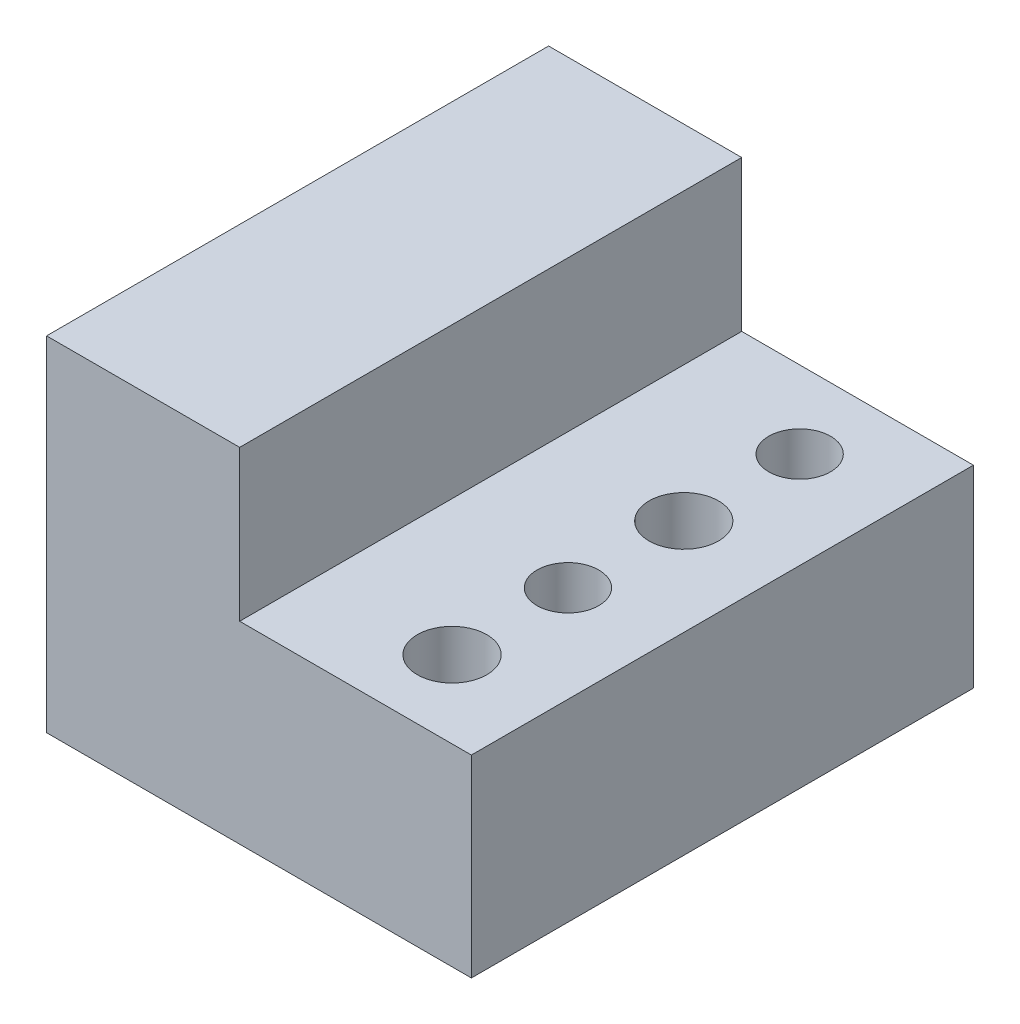
ISO-10303-21;
HEADER;
FILE_DESCRIPTION(('STEP AP214'),'2;1');
FILE_NAME('part.step','',(''),(''),'','','');
FILE_SCHEMA(('AUTOMOTIVE_DESIGN { 1 0 10303 214 1 1 1 1 }'));
ENDSEC;
DATA;
#1=APPLICATION_CONTEXT('core data for automotive mechanical design processes');
#2=APPLICATION_PROTOCOL_DEFINITION('international standard','automotive_design',2000,#1);
#3=PRODUCT_CONTEXT('',#1,'mechanical');
#4=PRODUCT('Part','Part','',(#3));
#5=PRODUCT_RELATED_PRODUCT_CATEGORY('part','',(#4));
#6=PRODUCT_DEFINITION_FORMATION('','',#4);
#7=PRODUCT_DEFINITION_CONTEXT('part definition',#1,'design');
#8=PRODUCT_DEFINITION('design','',#6,#7);
#9=PRODUCT_DEFINITION_SHAPE('','',#8);
#10=(LENGTH_UNIT() NAMED_UNIT(*) SI_UNIT(.MILLI.,.METRE.));
#11=(NAMED_UNIT(*) PLANE_ANGLE_UNIT() SI_UNIT($,.RADIAN.));
#12=(NAMED_UNIT(*) SI_UNIT($,.STERADIAN.) SOLID_ANGLE_UNIT());
#13=UNCERTAINTY_MEASURE_WITH_UNIT(LENGTH_MEASURE(1.E-05),#10,'distance_accuracy_value','');
#14=(GEOMETRIC_REPRESENTATION_CONTEXT(3) GLOBAL_UNCERTAINTY_ASSIGNED_CONTEXT((#13)) GLOBAL_UNIT_ASSIGNED_CONTEXT((#10,
#11,#12)) REPRESENTATION_CONTEXT('',''));
#15=CARTESIAN_POINT('',(0.,0.,0.));
#16=DIRECTION('',(0.,0.,1.));
#17=DIRECTION('',(1.,0.,0.));
#18=AXIS2_PLACEMENT_3D('',#15,#16,#17);
#19=CARTESIAN_POINT('',(-12.5,0.,55.));
#20=DIRECTION('',(0.,1.,0.));
#21=DIRECTION('',(0.,0.,1.));
#22=AXIS2_PLACEMENT_3D('',#19,#20,#21);
#23=CYLINDRICAL_SURFACE('',#22,4.50000000000001);
#24=CARTESIAN_POINT('',(-12.5,25.,55.));
#25=DIRECTION('',(0.,1.,0.));
#26=DIRECTION('',(0.,0.,1.));
#27=AXIS2_PLACEMENT_3D('',#24,#25,#26);
#28=CIRCLE('',#27,4.50000000000001);
#29=CARTESIAN_POINT('',(-12.5,25.,59.5));
#30=VERTEX_POINT('',#29);
#31=EDGE_CURVE('E144',#30,#30,#28,.T.);
#32=ORIENTED_EDGE('',*,*,#31,.T.);
#33=EDGE_LOOP('',(#32));
#34=FACE_BOUND('',#33,.T.);
#35=CARTESIAN_POINT('',(-12.5,10.,55.));
#36=DIRECTION('',(0.,-1.,0.));
#37=DIRECTION('',(1.,0.,0.));
#38=AXIS2_PLACEMENT_3D('',#35,#36,#37);
#39=CIRCLE('',#38,4.50000000000001);
#40=CARTESIAN_POINT('',(-7.99999999999999,10.,55.));
#41=VERTEX_POINT('',#40);
#42=EDGE_CURVE('E38',#41,#41,#39,.F.);
#43=ORIENTED_EDGE('',*,*,#42,.F.);
#44=EDGE_LOOP('',(#43));
#45=FACE_BOUND('',#44,.T.);
#46=ADVANCED_FACE('F34',(#34,#45),#23,.F.);
#47=CARTESIAN_POINT('',(-12.5,0.,25.));
#48=DIRECTION('',(0.,1.,0.));
#49=DIRECTION('',(0.,0.,1.));
#50=AXIS2_PLACEMENT_3D('',#47,#48,#49);
#51=CYLINDRICAL_SURFACE('',#50,4.5);
#52=CARTESIAN_POINT('',(-12.5,25.,25.));
#53=DIRECTION('',(0.,1.,0.));
#54=DIRECTION('',(0.,0.,1.));
#55=AXIS2_PLACEMENT_3D('',#52,#53,#54);
#56=CIRCLE('',#55,4.5);
#57=CARTESIAN_POINT('',(-12.5,25.,29.5));
#58=VERTEX_POINT('',#57);
#59=EDGE_CURVE('E163',#58,#58,#56,.T.);
#60=ORIENTED_EDGE('',*,*,#59,.T.);
#61=EDGE_LOOP('',(#60));
#62=FACE_BOUND('',#61,.T.);
#63=CARTESIAN_POINT('',(-12.5,10.,25.));
#64=DIRECTION('',(0.,-1.,0.));
#65=DIRECTION('',(1.,0.,0.));
#66=AXIS2_PLACEMENT_3D('',#63,#64,#65);
#67=CIRCLE('',#66,4.5);
#68=CARTESIAN_POINT('',(-8.,10.,25.));
#69=VERTEX_POINT('',#68);
#70=EDGE_CURVE('E138',#69,#69,#67,.F.);
#71=ORIENTED_EDGE('',*,*,#70,.F.);
#72=EDGE_LOOP('',(#71));
#73=FACE_BOUND('',#72,.T.);
#74=ADVANCED_FACE('F202',(#62,#73),#51,.F.);
#75=CARTESIAN_POINT('',(-30.,25.,65.));
#76=DIRECTION('',(0.,-1.,0.));
#77=DIRECTION('',(0.,0.,-1.));
#78=AXIS2_PLACEMENT_3D('',#75,#76,#77);
#79=PLANE('',#78);
#80=ORIENTED_EDGE('',*,*,#59,.F.);
#81=EDGE_LOOP('',(#80));
#82=FACE_BOUND('',#81,.T.);
#83=ORIENTED_EDGE('',*,*,#31,.F.);
#84=EDGE_LOOP('',(#83));
#85=FACE_BOUND('',#84,.T.);
#86=CARTESIAN_POINT('',(-12.5,25.,10.));
#87=DIRECTION('',(0.,1.,0.));
#88=DIRECTION('',(0.,0.,1.));
#89=AXIS2_PLACEMENT_3D('',#86,#87,#88);
#90=CIRCLE('',#89,4.);
#91=CARTESIAN_POINT('',(-12.5,25.,14.));
#92=VERTEX_POINT('',#91);
#93=EDGE_CURVE('E166',#92,#92,#90,.T.);
#94=ORIENTED_EDGE('',*,*,#93,.F.);
#95=EDGE_LOOP('',(#94));
#96=FACE_BOUND('',#95,.T.);
#97=DIRECTION('',(-1.,0.,0.));
#98=VECTOR('',#97,1.);
#99=CARTESIAN_POINT('',(-30.,25.,0.));
#100=LINE('',#99,#98);
#101=CARTESIAN_POINT('',(0.,25.,0.));
#102=VERTEX_POINT('',#101);
#103=CARTESIAN_POINT('',(-30.,25.,0.));
#104=VERTEX_POINT('',#103);
#105=EDGE_CURVE('E76',#102,#104,#100,.T.);
#106=ORIENTED_EDGE('',*,*,#105,.T.);
#107=DIRECTION('',(0.,0.,-1.));
#108=VECTOR('',#107,1.);
#109=CARTESIAN_POINT('',(-30.,25.,65.));
#110=LINE('',#109,#108);
#111=CARTESIAN_POINT('',(-30.,25.,65.));
#112=VERTEX_POINT('',#111);
#113=EDGE_CURVE('E113',#112,#104,#110,.T.);
#114=ORIENTED_EDGE('',*,*,#113,.F.);
#115=DIRECTION('',(-1.,0.,0.));
#116=VECTOR('',#115,1.);
#117=CARTESIAN_POINT('',(-30.,25.,65.));
#118=LINE('',#117,#116);
#119=CARTESIAN_POINT('',(0.,25.,65.));
#120=VERTEX_POINT('',#119);
#121=EDGE_CURVE('E101',#120,#112,#118,.T.);
#122=ORIENTED_EDGE('',*,*,#121,.F.);
#123=DIRECTION('',(0.,0.,-1.));
#124=VECTOR('',#123,1.);
#125=CARTESIAN_POINT('',(0.,25.,65.));
#126=LINE('',#125,#124);
#127=EDGE_CURVE('E108',#120,#102,#126,.T.);
#128=ORIENTED_EDGE('',*,*,#127,.T.);
#129=EDGE_LOOP('',(#106,#114,#122,#128));
#130=FACE_BOUND('',#129,.T.);
#131=CARTESIAN_POINT('',(-12.5,25.,40.));
#132=DIRECTION('',(0.,1.,0.));
#133=DIRECTION('',(0.,0.,1.));
#134=AXIS2_PLACEMENT_3D('',#131,#132,#133);
#135=CIRCLE('',#134,4.);
#136=CARTESIAN_POINT('',(-12.5,25.,44.));
#137=VERTEX_POINT('',#136);
#138=EDGE_CURVE('E174',#137,#137,#135,.T.);
#139=ORIENTED_EDGE('',*,*,#138,.F.);
#140=EDGE_LOOP('',(#139));
#141=FACE_BOUND('',#140,.T.);
#142=ADVANCED_FACE('F115',(#82,#85,#96,#130,#141),#79,.F.);
#143=CARTESIAN_POINT('',(-55.,44.5,65.));
#144=DIRECTION('',(0.,-1.,0.));
#145=DIRECTION('',(0.,0.,-1.));
#146=AXIS2_PLACEMENT_3D('',#143,#144,#145);
#147=PLANE('',#146);
#148=DIRECTION('',(-1.,0.,0.));
#149=VECTOR('',#148,1.);
#150=CARTESIAN_POINT('',(-55.,44.5,0.));
#151=LINE('',#150,#149);
#152=CARTESIAN_POINT('',(-30.,44.5,0.));
#153=VERTEX_POINT('',#152);
#154=CARTESIAN_POINT('',(-55.,44.5,0.));
#155=VERTEX_POINT('',#154);
#156=EDGE_CURVE('E122',#153,#155,#151,.T.);
#157=ORIENTED_EDGE('',*,*,#156,.T.);
#158=DIRECTION('',(0.,0.,-1.));
#159=VECTOR('',#158,1.);
#160=CARTESIAN_POINT('',(-55.,44.5,65.));
#161=LINE('',#160,#159);
#162=CARTESIAN_POINT('',(-55.,44.5,65.));
#163=VERTEX_POINT('',#162);
#164=EDGE_CURVE('E11',#163,#155,#161,.T.);
#165=ORIENTED_EDGE('',*,*,#164,.F.);
#166=DIRECTION('',(-1.,0.,0.));
#167=VECTOR('',#166,1.);
#168=CARTESIAN_POINT('',(-55.,44.5,65.));
#169=LINE('',#168,#167);
#170=CARTESIAN_POINT('',(-30.,44.5,65.));
#171=VERTEX_POINT('',#170);
#172=EDGE_CURVE('E133',#171,#163,#169,.T.);
#173=ORIENTED_EDGE('',*,*,#172,.F.);
#174=DIRECTION('',(0.,0.,-1.));
#175=VECTOR('',#174,1.);
#176=CARTESIAN_POINT('',(-30.,44.5,65.));
#177=LINE('',#176,#175);
#178=EDGE_CURVE('E118',#171,#153,#177,.T.);
#179=ORIENTED_EDGE('',*,*,#178,.T.);
#180=EDGE_LOOP('',(#157,#165,#173,#179));
#181=FACE_BOUND('',#180,.T.);
#182=ADVANCED_FACE('F36',(#181),#147,.F.);
#183=CARTESIAN_POINT('',(-55.,0.,65.));
#184=DIRECTION('',(1.,0.,0.));
#185=DIRECTION('',(0.,0.,-1.));
#186=AXIS2_PLACEMENT_3D('',#183,#184,#185);
#187=PLANE('',#186);
#188=CARTESIAN_POINT('',(-55.,32.,10.));
#189=DIRECTION('',(-1.,0.,0.));
#190=DIRECTION('',(0.,0.,1.));
#191=AXIS2_PLACEMENT_3D('',#188,#189,#190);
#192=CIRCLE('',#191,3.4);
#193=CARTESIAN_POINT('',(-55.,32.,13.4));
#194=VERTEX_POINT('',#193);
#195=EDGE_CURVE('E418',#194,#194,#192,.T.);
#196=ORIENTED_EDGE('',*,*,#195,.F.);
#197=EDGE_LOOP('',(#196));
#198=FACE_BOUND('',#197,.T.);
#199=CARTESIAN_POINT('',(-55.,32.,25.));
#200=DIRECTION('',(-1.,0.,0.));
#201=DIRECTION('',(0.,0.,1.));
#202=AXIS2_PLACEMENT_3D('',#199,#200,#201);
#203=CIRCLE('',#202,3.99999999999999);
#204=CARTESIAN_POINT('',(-55.,32.,29.));
#205=VERTEX_POINT('',#204);
#206=EDGE_CURVE('E422',#205,#205,#203,.T.);
#207=ORIENTED_EDGE('',*,*,#206,.F.);
#208=EDGE_LOOP('',(#207));
#209=FACE_BOUND('',#208,.T.);
#210=CARTESIAN_POINT('',(-55.,32.,40.));
#211=DIRECTION('',(-1.,0.,0.));
#212=DIRECTION('',(0.,0.,1.));
#213=AXIS2_PLACEMENT_3D('',#210,#211,#212);
#214=CIRCLE('',#213,3.4);
#215=CARTESIAN_POINT('',(-55.,32.,43.4));
#216=VERTEX_POINT('',#215);
#217=EDGE_CURVE('E426',#216,#216,#214,.T.);
#218=ORIENTED_EDGE('',*,*,#217,.F.);
#219=EDGE_LOOP('',(#218));
#220=FACE_BOUND('',#219,.T.);
#221=CARTESIAN_POINT('',(-55.,32.,55.));
#222=DIRECTION('',(-1.,0.,0.));
#223=DIRECTION('',(0.,0.,1.));
#224=AXIS2_PLACEMENT_3D('',#221,#222,#223);
#225=CIRCLE('',#224,4.);
#226=CARTESIAN_POINT('',(-55.,32.,59.));
#227=VERTEX_POINT('',#226);
#228=EDGE_CURVE('E154',#227,#227,#225,.T.);
#229=ORIENTED_EDGE('',*,*,#228,.F.);
#230=EDGE_LOOP('',(#229));
#231=FACE_BOUND('',#230,.T.);
#232=DIRECTION('',(0.,-1.,0.));
#233=VECTOR('',#232,1.);
#234=CARTESIAN_POINT('',(-55.,0.,0.));
#235=LINE('',#234,#233);
#236=CARTESIAN_POINT('',(-55.,0.,0.));
#237=VERTEX_POINT('',#236);
#238=EDGE_CURVE('E125',#155,#237,#235,.T.);
#239=ORIENTED_EDGE('',*,*,#238,.T.);
#240=DIRECTION('',(0.,0.,-1.));
#241=VECTOR('',#240,1.);
#242=CARTESIAN_POINT('',(-55.,0.,65.));
#243=LINE('',#242,#241);
#244=CARTESIAN_POINT('',(-55.,0.,65.));
#245=VERTEX_POINT('',#244);
#246=EDGE_CURVE('E44',#245,#237,#243,.T.);
#247=ORIENTED_EDGE('',*,*,#246,.F.);
#248=DIRECTION('',(0.,-1.,0.));
#249=VECTOR('',#248,1.);
#250=CARTESIAN_POINT('',(-55.,0.,65.));
#251=LINE('',#250,#249);
#252=EDGE_CURVE('E90',#163,#245,#251,.T.);
#253=ORIENTED_EDGE('',*,*,#252,.F.);
#254=ORIENTED_EDGE('',*,*,#164,.T.);
#255=EDGE_LOOP('',(#239,#247,#253,#254));
#256=FACE_BOUND('',#255,.T.);
#257=ADVANCED_FACE('F182',(#198,#209,#220,#231,#256),#187,.F.);
#258=CARTESIAN_POINT('',(0.,0.,65.));
#259=DIRECTION('',(0.,1.,0.));
#260=DIRECTION('',(-1.,0.,0.));
#261=AXIS2_PLACEMENT_3D('',#258,#259,#260);
#262=PLANE('',#261);
#263=CARTESIAN_POINT('',(-12.5,0.,55.));
#264=DIRECTION('',(0.,-1.,0.));
#265=DIRECTION('',(1.,0.,0.));
#266=AXIS2_PLACEMENT_3D('',#263,#264,#265);
#267=CIRCLE('',#266,7.5);
#268=CARTESIAN_POINT('',(-5.,0.,55.));
#269=VERTEX_POINT('',#268);
#270=EDGE_CURVE('E146',#269,#269,#267,.T.);
#271=ORIENTED_EDGE('',*,*,#270,.F.);
#272=EDGE_LOOP('',(#271));
#273=FACE_BOUND('',#272,.T.);
#274=CARTESIAN_POINT('',(-12.5,0.,25.));
#275=DIRECTION('',(0.,-1.,0.));
#276=DIRECTION('',(1.,0.,0.));
#277=AXIS2_PLACEMENT_3D('',#274,#275,#276);
#278=CIRCLE('',#277,7.5);
#279=CARTESIAN_POINT('',(-5.,0.,25.));
#280=VERTEX_POINT('',#279);
#281=EDGE_CURVE('E159',#280,#280,#278,.T.);
#282=ORIENTED_EDGE('',*,*,#281,.F.);
#283=EDGE_LOOP('',(#282));
#284=FACE_BOUND('',#283,.T.);
#285=CARTESIAN_POINT('',(-12.5,0.,10.));
#286=DIRECTION('',(0.,1.,0.));
#287=DIRECTION('',(-1.,0.,0.));
#288=AXIS2_PLACEMENT_3D('',#285,#286,#287);
#289=CIRCLE('',#288,3.99999999999999);
#290=CARTESIAN_POINT('',(-16.5,0.,10.));
#291=VERTEX_POINT('',#290);
#292=EDGE_CURVE('E171',#291,#291,#289,.T.);
#293=ORIENTED_EDGE('',*,*,#292,.T.);
#294=EDGE_LOOP('',(#293));
#295=FACE_BOUND('',#294,.T.);
#296=CARTESIAN_POINT('',(-12.5,0.,40.));
#297=DIRECTION('',(0.,1.,0.));
#298=DIRECTION('',(-1.,0.,0.));
#299=AXIS2_PLACEMENT_3D('',#296,#297,#298);
#300=CIRCLE('',#299,3.99999999999999);
#301=CARTESIAN_POINT('',(-16.5,0.,40.));
#302=VERTEX_POINT('',#301);
#303=EDGE_CURVE('E126',#302,#302,#300,.T.);
#304=ORIENTED_EDGE('',*,*,#303,.T.);
#305=EDGE_LOOP('',(#304));
#306=FACE_BOUND('',#305,.T.);
#307=DIRECTION('',(1.,0.,0.));
#308=VECTOR('',#307,1.);
#309=CARTESIAN_POINT('',(0.,0.,0.));
#310=LINE('',#309,#308);
#311=CARTESIAN_POINT('',(0.,0.,0.));
#312=VERTEX_POINT('',#311);
#313=EDGE_CURVE('E128',#237,#312,#310,.T.);
#314=ORIENTED_EDGE('',*,*,#313,.T.);
#315=DIRECTION('',(0.,0.,-1.));
#316=VECTOR('',#315,1.);
#317=CARTESIAN_POINT('',(0.,0.,65.));
#318=LINE('',#317,#316);
#319=CARTESIAN_POINT('',(0.,0.,65.));
#320=VERTEX_POINT('',#319);
#321=EDGE_CURVE('E112',#320,#312,#318,.T.);
#322=ORIENTED_EDGE('',*,*,#321,.F.);
#323=DIRECTION('',(1.,0.,0.));
#324=VECTOR('',#323,1.);
#325=CARTESIAN_POINT('',(0.,0.,65.));
#326=LINE('',#325,#324);
#327=EDGE_CURVE('E103',#245,#320,#326,.T.);
#328=ORIENTED_EDGE('',*,*,#327,.F.);
#329=ORIENTED_EDGE('',*,*,#246,.T.);
#330=EDGE_LOOP('',(#314,#322,#328,#329));
#331=FACE_BOUND('',#330,.T.);
#332=ADVANCED_FACE('F185',(#273,#284,#295,#306,#331),#262,.F.);
#333=CARTESIAN_POINT('',(0.,25.,65.));
#334=DIRECTION('',(-1.,0.,0.));
#335=DIRECTION('',(0.,-1.,0.));
#336=AXIS2_PLACEMENT_3D('',#333,#334,#335);
#337=PLANE('',#336);
#338=DIRECTION('',(0.,1.,0.));
#339=VECTOR('',#338,1.);
#340=CARTESIAN_POINT('',(0.,25.,0.));
#341=LINE('',#340,#339);
#342=EDGE_CURVE('E111',#312,#102,#341,.T.);
#343=ORIENTED_EDGE('',*,*,#342,.T.);
#344=ORIENTED_EDGE('',*,*,#127,.F.);
#345=DIRECTION('',(0.,1.,0.));
#346=VECTOR('',#345,1.);
#347=CARTESIAN_POINT('',(0.,25.,65.));
#348=LINE('',#347,#346);
#349=EDGE_CURVE('E97',#320,#120,#348,.T.);
#350=ORIENTED_EDGE('',*,*,#349,.F.);
#351=ORIENTED_EDGE('',*,*,#321,.T.);
#352=EDGE_LOOP('',(#343,#344,#350,#351));
#353=FACE_BOUND('',#352,.T.);
#354=ADVANCED_FACE('F109',(#353),#337,.F.);
#355=CARTESIAN_POINT('',(-30.,44.5,65.));
#356=DIRECTION('',(-1.,0.,0.));
#357=DIRECTION('',(0.,-1.,0.));
#358=AXIS2_PLACEMENT_3D('',#355,#356,#357);
#359=PLANE('',#358);
#360=DIRECTION('',(0.,1.,0.));
#361=VECTOR('',#360,1.);
#362=CARTESIAN_POINT('',(-30.,44.5,0.));
#363=LINE('',#362,#361);
#364=EDGE_CURVE('E82',#104,#153,#363,.T.);
#365=ORIENTED_EDGE('',*,*,#364,.T.);
#366=ORIENTED_EDGE('',*,*,#178,.F.);
#367=DIRECTION('',(0.,1.,0.));
#368=VECTOR('',#367,1.);
#369=CARTESIAN_POINT('',(-30.,44.5,65.));
#370=LINE('',#369,#368);
#371=EDGE_CURVE('E53',#112,#171,#370,.T.);
#372=ORIENTED_EDGE('',*,*,#371,.F.);
#373=ORIENTED_EDGE('',*,*,#113,.T.);
#374=EDGE_LOOP('',(#365,#366,#372,#373));
#375=FACE_BOUND('',#374,.T.);
#376=ADVANCED_FACE('F190',(#375),#359,.F.);
#377=CARTESIAN_POINT('',(0.,0.,65.));
#378=DIRECTION('',(0.,0.,-1.));
#379=DIRECTION('',(-1.,0.,0.));
#380=AXIS2_PLACEMENT_3D('',#377,#378,#379);
#381=PLANE('',#380);
#382=ORIENTED_EDGE('',*,*,#172,.T.);
#383=ORIENTED_EDGE('',*,*,#252,.T.);
#384=ORIENTED_EDGE('',*,*,#327,.T.);
#385=ORIENTED_EDGE('',*,*,#349,.T.);
#386=ORIENTED_EDGE('',*,*,#121,.T.);
#387=ORIENTED_EDGE('',*,*,#371,.T.);
#388=EDGE_LOOP('',(#382,#383,#384,#385,#386,#387));
#389=FACE_BOUND('',#388,.T.);
#390=ADVANCED_FACE('F99',(#389),#381,.F.);
#391=CARTESIAN_POINT('',(0.,0.,0.));
#392=DIRECTION('',(0.,0.,-1.));
#393=DIRECTION('',(-1.,0.,0.));
#394=AXIS2_PLACEMENT_3D('',#391,#392,#393);
#395=PLANE('',#394);
#396=ORIENTED_EDGE('',*,*,#156,.F.);
#397=ORIENTED_EDGE('',*,*,#364,.F.);
#398=ORIENTED_EDGE('',*,*,#105,.F.);
#399=ORIENTED_EDGE('',*,*,#342,.F.);
#400=ORIENTED_EDGE('',*,*,#313,.F.);
#401=ORIENTED_EDGE('',*,*,#238,.F.);
#402=EDGE_LOOP('',(#396,#397,#398,#399,#400,#401));
#403=FACE_BOUND('',#402,.T.);
#404=ADVANCED_FACE('F188',(#403),#395,.T.);
#405=CARTESIAN_POINT('',(-12.5,25.,40.));
#406=DIRECTION('',(0.,1.,0.));
#407=DIRECTION('',(0.,0.,1.));
#408=AXIS2_PLACEMENT_3D('',#405,#406,#407);
#409=CYLINDRICAL_SURFACE('',#408,3.99999999999999);
#410=ORIENTED_EDGE('',*,*,#303,.F.);
#411=EDGE_LOOP('',(#410));
#412=FACE_BOUND('',#411,.T.);
#413=ORIENTED_EDGE('',*,*,#138,.T.);
#414=EDGE_LOOP('',(#413));
#415=FACE_BOUND('',#414,.T.);
#416=ADVANCED_FACE('F217',(#412,#415),#409,.F.);
#417=CARTESIAN_POINT('',(-12.5,25.,10.));
#418=DIRECTION('',(0.,1.,0.));
#419=DIRECTION('',(0.,0.,1.));
#420=AXIS2_PLACEMENT_3D('',#417,#418,#419);
#421=CYLINDRICAL_SURFACE('',#420,3.99999999999999);
#422=ORIENTED_EDGE('',*,*,#292,.F.);
#423=EDGE_LOOP('',(#422));
#424=FACE_BOUND('',#423,.T.);
#425=ORIENTED_EDGE('',*,*,#93,.T.);
#426=EDGE_LOOP('',(#425));
#427=FACE_BOUND('',#426,.T.);
#428=ADVANCED_FACE('F213',(#424,#427),#421,.F.);
#429=CARTESIAN_POINT('',(-12.5,10.,25.));
#430=DIRECTION('',(0.,-1.,0.));
#431=DIRECTION('',(1.,0.,0.));
#432=AXIS2_PLACEMENT_3D('',#429,#430,#431);
#433=PLANE('',#432);
#434=CARTESIAN_POINT('',(-12.5,10.,25.));
#435=DIRECTION('',(0.,-1.,0.));
#436=DIRECTION('',(1.,0.,0.));
#437=AXIS2_PLACEMENT_3D('',#434,#435,#436);
#438=CIRCLE('',#437,7.5);
#439=CARTESIAN_POINT('',(-5.,10.,25.));
#440=VERTEX_POINT('',#439);
#441=EDGE_CURVE('E151',#440,#440,#438,.T.);
#442=ORIENTED_EDGE('',*,*,#441,.T.);
#443=EDGE_LOOP('',(#442));
#444=FACE_BOUND('',#443,.T.);
#445=ORIENTED_EDGE('',*,*,#70,.T.);
#446=EDGE_LOOP('',(#445));
#447=FACE_BOUND('',#446,.T.);
#448=ADVANCED_FACE('F216',(#444,#447),#433,.T.);
#449=CARTESIAN_POINT('',(-12.5,10.,25.));
#450=DIRECTION('',(0.,-1.,0.));
#451=DIRECTION('',(1.,0.,0.));
#452=AXIS2_PLACEMENT_3D('',#449,#450,#451);
#453=CYLINDRICAL_SURFACE('',#452,7.5);
#454=ORIENTED_EDGE('',*,*,#441,.F.);
#455=EDGE_LOOP('',(#454));
#456=FACE_BOUND('',#455,.T.);
#457=ORIENTED_EDGE('',*,*,#281,.T.);
#458=EDGE_LOOP('',(#457));
#459=FACE_BOUND('',#458,.T.);
#460=ADVANCED_FACE('F241',(#456,#459),#453,.F.);
#461=CARTESIAN_POINT('',(-12.5,10.,55.));
#462=DIRECTION('',(0.,-1.,0.));
#463=DIRECTION('',(1.,0.,0.));
#464=AXIS2_PLACEMENT_3D('',#461,#462,#463);
#465=PLANE('',#464);
#466=CARTESIAN_POINT('',(-12.5,10.,55.));
#467=DIRECTION('',(0.,-1.,0.));
#468=DIRECTION('',(1.,0.,0.));
#469=AXIS2_PLACEMENT_3D('',#466,#467,#468);
#470=CIRCLE('',#469,7.5);
#471=CARTESIAN_POINT('',(-5.,10.,55.));
#472=VERTEX_POINT('',#471);
#473=EDGE_CURVE('E140',#472,#472,#470,.T.);
#474=ORIENTED_EDGE('',*,*,#473,.T.);
#475=EDGE_LOOP('',(#474));
#476=FACE_BOUND('',#475,.T.);
#477=ORIENTED_EDGE('',*,*,#42,.T.);
#478=EDGE_LOOP('',(#477));
#479=FACE_BOUND('',#478,.T.);
#480=ADVANCED_FACE('F250',(#476,#479),#465,.T.);
#481=CARTESIAN_POINT('',(-12.5,10.,55.));
#482=DIRECTION('',(0.,-1.,0.));
#483=DIRECTION('',(1.,0.,0.));
#484=AXIS2_PLACEMENT_3D('',#481,#482,#483);
#485=CYLINDRICAL_SURFACE('',#484,7.5);
#486=ORIENTED_EDGE('',*,*,#473,.F.);
#487=EDGE_LOOP('',(#486));
#488=FACE_BOUND('',#487,.T.);
#489=ORIENTED_EDGE('',*,*,#270,.T.);
#490=EDGE_LOOP('',(#489));
#491=FACE_BOUND('',#490,.T.);
#492=ADVANCED_FACE('F257',(#488,#491),#485,.F.);
#493=CARTESIAN_POINT('',(-31.,32.,55.));
#494=DIRECTION('',(-1.,0.,0.));
#495=DIRECTION('',(0.,0.,1.));
#496=AXIS2_PLACEMENT_3D('',#493,#494,#495);
#497=CYLINDRICAL_SURFACE('',#496,4.);
#498=CARTESIAN_POINT('',(-31.,32.,55.));
#499=DIRECTION('',(-1.,0.,0.));
#500=DIRECTION('',(0.,0.,1.));
#501=AXIS2_PLACEMENT_3D('',#498,#499,#500);
#502=CIRCLE('',#501,4.);
#503=CARTESIAN_POINT('',(-31.,32.,59.));
#504=VERTEX_POINT('',#503);
#505=EDGE_CURVE('E430',#504,#504,#502,.T.);
#506=ORIENTED_EDGE('',*,*,#505,.F.);
#507=EDGE_LOOP('',(#506));
#508=FACE_BOUND('',#507,.T.);
#509=ORIENTED_EDGE('',*,*,#228,.T.);
#510=EDGE_LOOP('',(#509));
#511=FACE_BOUND('',#510,.T.);
#512=ADVANCED_FACE('F264',(#508,#511),#497,.F.);
#513=CARTESIAN_POINT('',(-31.,32.,55.));
#514=DIRECTION('',(-1.,0.,0.));
#515=DIRECTION('',(0.,0.,1.));
#516=AXIS2_PLACEMENT_3D('',#513,#514,#515);
#517=PLANE('',#516);
#518=ORIENTED_EDGE('',*,*,#505,.T.);
#519=EDGE_LOOP('',(#518));
#520=FACE_BOUND('',#519,.T.);
#521=ADVANCED_FACE('F273',(#520),#517,.T.);
#522=CARTESIAN_POINT('',(-31.,32.,40.));
#523=DIRECTION('',(-1.,0.,0.));
#524=DIRECTION('',(0.,0.,1.));
#525=AXIS2_PLACEMENT_3D('',#522,#523,#524);
#526=CYLINDRICAL_SURFACE('',#525,3.4);
#527=CARTESIAN_POINT('',(-31.,32.,40.));
#528=DIRECTION('',(-1.,0.,0.));
#529=DIRECTION('',(0.,0.,1.));
#530=AXIS2_PLACEMENT_3D('',#527,#528,#529);
#531=CIRCLE('',#530,3.4);
#532=CARTESIAN_POINT('',(-31.,32.,43.4));
#533=VERTEX_POINT('',#532);
#534=EDGE_CURVE('E433',#533,#533,#531,.T.);
#535=ORIENTED_EDGE('',*,*,#534,.F.);
#536=EDGE_LOOP('',(#535));
#537=FACE_BOUND('',#536,.T.);
#538=ORIENTED_EDGE('',*,*,#217,.T.);
#539=EDGE_LOOP('',(#538));
#540=FACE_BOUND('',#539,.T.);
#541=ADVANCED_FACE('F281',(#537,#540),#526,.F.);
#542=CARTESIAN_POINT('',(-31.,32.,40.));
#543=DIRECTION('',(-1.,0.,0.));
#544=DIRECTION('',(0.,0.,1.));
#545=AXIS2_PLACEMENT_3D('',#542,#543,#544);
#546=PLANE('',#545);
#547=ORIENTED_EDGE('',*,*,#534,.T.);
#548=EDGE_LOOP('',(#547));
#549=FACE_BOUND('',#548,.T.);
#550=ADVANCED_FACE('F289',(#549),#546,.T.);
#551=CARTESIAN_POINT('',(-31.,32.,25.));
#552=DIRECTION('',(-1.,0.,0.));
#553=DIRECTION('',(0.,0.,1.));
#554=AXIS2_PLACEMENT_3D('',#551,#552,#553);
#555=CYLINDRICAL_SURFACE('',#554,3.99999999999999);
#556=CARTESIAN_POINT('',(-31.,32.,25.));
#557=DIRECTION('',(-1.,0.,0.));
#558=DIRECTION('',(0.,0.,1.));
#559=AXIS2_PLACEMENT_3D('',#556,#557,#558);
#560=CIRCLE('',#559,3.99999999999999);
#561=CARTESIAN_POINT('',(-31.,32.,29.));
#562=VERTEX_POINT('',#561);
#563=EDGE_CURVE('E439',#562,#562,#560,.T.);
#564=ORIENTED_EDGE('',*,*,#563,.F.);
#565=EDGE_LOOP('',(#564));
#566=FACE_BOUND('',#565,.T.);
#567=ORIENTED_EDGE('',*,*,#206,.T.);
#568=EDGE_LOOP('',(#567));
#569=FACE_BOUND('',#568,.T.);
#570=ADVANCED_FACE('F297',(#566,#569),#555,.F.);
#571=CARTESIAN_POINT('',(-31.,32.,25.));
#572=DIRECTION('',(-1.,0.,0.));
#573=DIRECTION('',(0.,0.,1.));
#574=AXIS2_PLACEMENT_3D('',#571,#572,#573);
#575=PLANE('',#574);
#576=ORIENTED_EDGE('',*,*,#563,.T.);
#577=EDGE_LOOP('',(#576));
#578=FACE_BOUND('',#577,.T.);
#579=ADVANCED_FACE('F305',(#578),#575,.T.);
#580=CARTESIAN_POINT('',(-31.,32.,10.));
#581=DIRECTION('',(-1.,0.,0.));
#582=DIRECTION('',(0.,0.,1.));
#583=AXIS2_PLACEMENT_3D('',#580,#581,#582);
#584=CYLINDRICAL_SURFACE('',#583,3.4);
#585=CARTESIAN_POINT('',(-31.,32.,10.));
#586=DIRECTION('',(-1.,0.,0.));
#587=DIRECTION('',(0.,0.,1.));
#588=AXIS2_PLACEMENT_3D('',#585,#586,#587);
#589=CIRCLE('',#588,3.4);
#590=CARTESIAN_POINT('',(-31.,32.,13.4));
#591=VERTEX_POINT('',#590);
#592=EDGE_CURVE('E162',#591,#591,#589,.T.);
#593=ORIENTED_EDGE('',*,*,#592,.F.);
#594=EDGE_LOOP('',(#593));
#595=FACE_BOUND('',#594,.T.);
#596=ORIENTED_EDGE('',*,*,#195,.T.);
#597=EDGE_LOOP('',(#596));
#598=FACE_BOUND('',#597,.T.);
#599=ADVANCED_FACE('F313',(#595,#598),#584,.F.);
#600=CARTESIAN_POINT('',(-31.,32.,10.));
#601=DIRECTION('',(-1.,0.,0.));
#602=DIRECTION('',(0.,0.,1.));
#603=AXIS2_PLACEMENT_3D('',#600,#601,#602);
#604=PLANE('',#603);
#605=ORIENTED_EDGE('',*,*,#592,.T.);
#606=EDGE_LOOP('',(#605));
#607=FACE_BOUND('',#606,.T.);
#608=ADVANCED_FACE('F321',(#607),#604,.T.);
#609=CLOSED_SHELL('',(#46,#74,#142,#182,#257,#332,#354,#376,#390,#404,#416,#428,#448,#460,#480,
#492,#512,#521,#541,#550,#570,#579,#599,#608));
#610=MANIFOLD_SOLID_BREP('B2',#609);
#611=ADVANCED_BREP_SHAPE_REPRESENTATION('',(#18,#610),#14);
#612=SHAPE_DEFINITION_REPRESENTATION(#9,#611);
ENDSEC;
END-ISO-10303-21;
